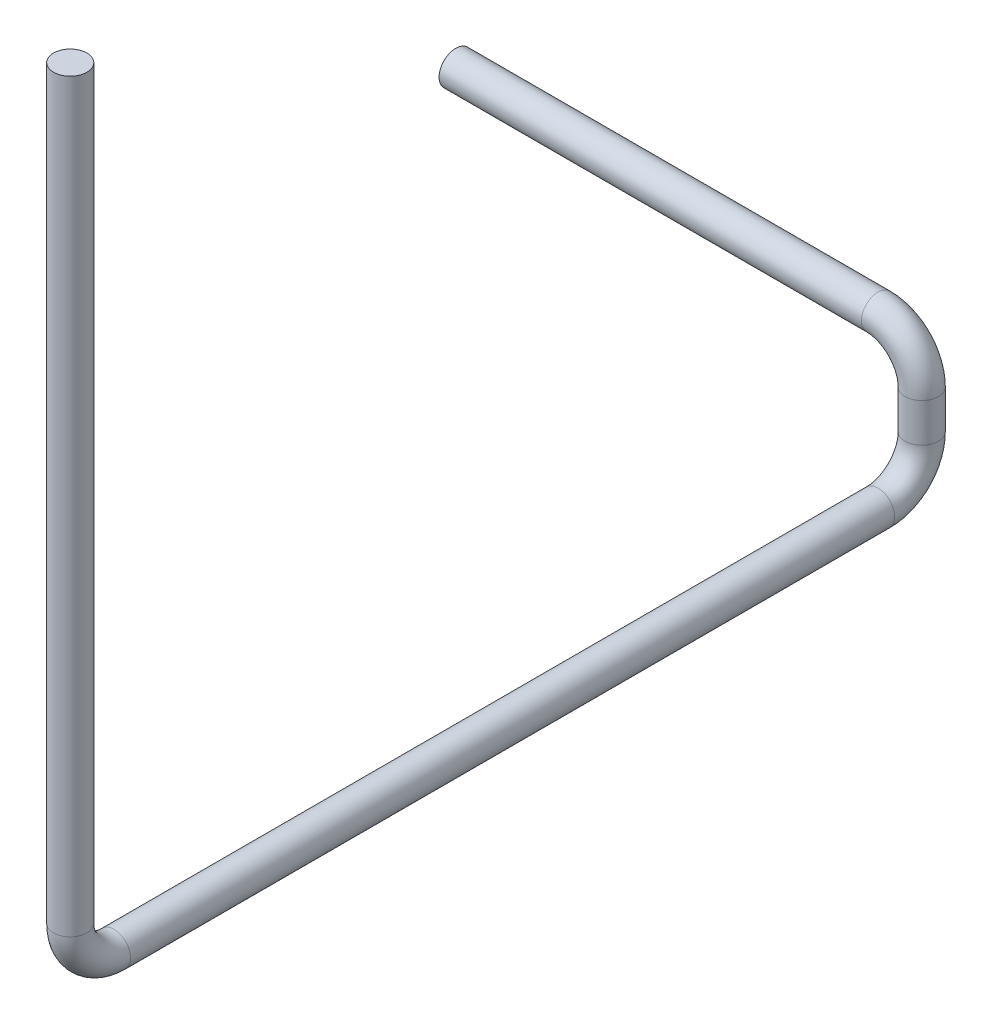
ISO-10303-21;
HEADER;
FILE_DESCRIPTION(('STEP AP214'),'2;1');
FILE_NAME('part.step','',(''),(''),'','','');
FILE_SCHEMA(('AUTOMOTIVE_DESIGN { 1 0 10303 214 1 1 1 1 }'));
ENDSEC;
DATA;
#1=APPLICATION_CONTEXT('core data for automotive mechanical design processes');
#2=APPLICATION_PROTOCOL_DEFINITION('international standard','automotive_design',2000,#1);
#3=PRODUCT_CONTEXT('',#1,'mechanical');
#4=PRODUCT('Part','Part','',(#3));
#5=PRODUCT_RELATED_PRODUCT_CATEGORY('part','',(#4));
#6=PRODUCT_DEFINITION_FORMATION('','',#4);
#7=PRODUCT_DEFINITION_CONTEXT('part definition',#1,'design');
#8=PRODUCT_DEFINITION('design','',#6,#7);
#9=PRODUCT_DEFINITION_SHAPE('','',#8);
#10=(LENGTH_UNIT() NAMED_UNIT(*) SI_UNIT(.MILLI.,.METRE.));
#11=(NAMED_UNIT(*) PLANE_ANGLE_UNIT() SI_UNIT($,.RADIAN.));
#12=(NAMED_UNIT(*) SI_UNIT($,.STERADIAN.) SOLID_ANGLE_UNIT());
#13=UNCERTAINTY_MEASURE_WITH_UNIT(LENGTH_MEASURE(1.E-05),#10,'distance_accuracy_value','');
#14=(GEOMETRIC_REPRESENTATION_CONTEXT(3) GLOBAL_UNCERTAINTY_ASSIGNED_CONTEXT((#13)) GLOBAL_UNIT_ASSIGNED_CONTEXT((#10,
#11,#12)) REPRESENTATION_CONTEXT('',''));
#15=CARTESIAN_POINT('',(0.,0.,0.));
#16=DIRECTION('',(0.,0.,1.));
#17=DIRECTION('',(1.,0.,0.));
#18=AXIS2_PLACEMENT_3D('',#15,#16,#17);
#19=CARTESIAN_POINT('',(1117.59003251347,-243.390046142145,2257.04999999998));
#20=DIRECTION('',(-1.,0.,0.));
#21=DIRECTION('',(0.,0.,1.));
#22=AXIS2_PLACEMENT_3D('',#19,#20,#21);
#23=PLANE('',#22);
#24=CARTESIAN_POINT('',(1117.59003251347,-243.390046142145,2257.04999999998));
#25=DIRECTION('',(-1.,0.,0.));
#26=DIRECTION('',(0.,0.,1.));
#27=AXIS2_PLACEMENT_3D('',#24,#25,#26);
#28=CIRCLE('',#27,19.05);
#29=CARTESIAN_POINT('',(1117.59003251347,-243.390046142145,2276.09999999998));
#30=VERTEX_POINT('',#29);
#31=EDGE_CURVE('E57',#30,#30,#28,.T.);
#32=ORIENTED_EDGE('',*,*,#31,.T.);
#33=EDGE_LOOP('',(#32));
#34=FACE_BOUND('',#33,.T.);
#35=ADVANCED_FACE('F45',(#34),#23,.T.);
#36=CARTESIAN_POINT('',(1650.47736651347,514.750220823855,3230.80586099998));
#37=DIRECTION('',(0.,-1.,0.));
#38=DIRECTION('',(0.,0.,-1.));
#39=AXIS2_PLACEMENT_3D('',#36,#37,#38);
#40=PLANE('',#39);
#41=CARTESIAN_POINT('',(1650.47736651347,514.750220823855,3230.80586099998));
#42=DIRECTION('',(0.,-1.,0.));
#43=DIRECTION('',(0.,0.,-1.));
#44=AXIS2_PLACEMENT_3D('',#41,#42,#43);
#45=CIRCLE('',#44,19.05);
#46=CARTESIAN_POINT('',(1650.47736651347,514.750220823855,3211.75586099998));
#47=VERTEX_POINT('',#46);
#48=EDGE_CURVE('E12',#47,#47,#45,.T.);
#49=ORIENTED_EDGE('',*,*,#48,.F.);
#50=EDGE_LOOP('',(#49));
#51=FACE_BOUND('',#50,.T.);
#52=ADVANCED_FACE('F63',(#51),#40,.F.);
#53=CARTESIAN_POINT('',(1117.59003251347,-243.390046142145,2257.04999999998));
#54=DIRECTION('',(1.,0.,0.));
#55=DIRECTION('',(0.,0.,-1.));
#56=AXIS2_PLACEMENT_3D('',#53,#54,#55);
#57=CYLINDRICAL_SURFACE('',#56,19.05);
#58=CARTESIAN_POINT('',(1600.47736651347,-243.390046142145,2257.04999999998));
#59=DIRECTION('',(-1.,0.,0.));
#60=DIRECTION('',(0.,0.,1.));
#61=AXIS2_PLACEMENT_3D('',#58,#59,#60);
#62=CIRCLE('',#61,19.05);
#63=CARTESIAN_POINT('',(1600.47736651347,-224.340046142145,2257.04999999998));
#64=VERTEX_POINT('',#63);
#65=EDGE_CURVE('E105',#64,#64,#62,.T.);
#66=ORIENTED_EDGE('',*,*,#65,.T.);
#67=EDGE_LOOP('',(#66));
#68=FACE_BOUND('',#67,.T.);
#69=ORIENTED_EDGE('',*,*,#31,.F.);
#70=EDGE_LOOP('',(#69));
#71=FACE_BOUND('',#70,.T.);
#72=ADVANCED_FACE('F65',(#68,#71),#57,.T.);
#73=CARTESIAN_POINT('',(1600.47736651347,-293.390046142145,2257.04999999998));
#74=DIRECTION('',(0.,0.,-1.));
#75=DIRECTION('',(-1.,0.,0.));
#76=AXIS2_PLACEMENT_3D('',#73,#74,#75);
#77=TOROIDAL_SURFACE('',#76,49.9999999999999,19.05);
#78=CARTESIAN_POINT('',(1650.47736651347,-293.390046142145,2257.04999999998));
#79=DIRECTION('',(0.,1.,0.));
#80=DIRECTION('',(0.,0.,1.));
#81=AXIS2_PLACEMENT_3D('',#78,#79,#80);
#82=CIRCLE('',#81,19.05);
#83=CARTESIAN_POINT('',(1669.52736651347,-293.390046142145,2257.04999999998));
#84=VERTEX_POINT('',#83);
#85=EDGE_CURVE('E102',#84,#84,#82,.T.);
#86=CARTESIAN_POINT('',(1600.47736651347,-293.390046142145,2257.04999999998));
#87=DIRECTION('',(0.,0.,-1.));
#88=DIRECTION('',(-1.,0.,0.));
#89=AXIS2_PLACEMENT_3D('',#86,#87,#88);
#90=CIRCLE('',#89,69.0499999999999);
#91=EDGE_CURVE('',#64,#84,#90,.T.);
#92=ORIENTED_EDGE('',*,*,#65,.F.);
#93=ORIENTED_EDGE('',*,*,#85,.T.);
#94=ORIENTED_EDGE('',*,*,#91,.T.);
#95=ORIENTED_EDGE('',*,*,#91,.F.);
#96=EDGE_LOOP('',(#92,#94,#93,#95));
#97=FACE_BOUND('',#96,.T.);
#98=ADVANCED_FACE('F70',(#97),#77,.T.);
#99=CARTESIAN_POINT('',(1650.47736651347,-293.390046142145,2257.04999999998));
#100=DIRECTION('',(0.,-1.,0.));
#101=DIRECTION('',(0.,0.,-1.));
#102=AXIS2_PLACEMENT_3D('',#99,#100,#101);
#103=CYLINDRICAL_SURFACE('',#102,19.05);
#104=CARTESIAN_POINT('',(1650.47736651347,-337.599174545866,2257.04999999998));
#105=DIRECTION('',(0.,1.,0.));
#106=DIRECTION('',(0.,0.,1.));
#107=AXIS2_PLACEMENT_3D('',#104,#105,#106);
#108=CIRCLE('',#107,19.05);
#109=CARTESIAN_POINT('',(1650.47736651347,-337.599174545866,2237.99999999998));
#110=VERTEX_POINT('',#109);
#111=EDGE_CURVE('E107',#110,#110,#108,.T.);
#112=ORIENTED_EDGE('',*,*,#111,.T.);
#113=EDGE_LOOP('',(#112));
#114=FACE_BOUND('',#113,.T.);
#115=ORIENTED_EDGE('',*,*,#85,.F.);
#116=EDGE_LOOP('',(#115));
#117=FACE_BOUND('',#116,.T.);
#118=ADVANCED_FACE('F90',(#114,#117),#103,.T.);
#119=CARTESIAN_POINT('',(1650.47736651347,-337.599174545866,2307.04999999998));
#120=DIRECTION('',(-1.,0.,0.));
#121=DIRECTION('',(0.,0.,1.));
#122=AXIS2_PLACEMENT_3D('',#119,#120,#121);
#123=TOROIDAL_SURFACE('',#122,49.9999999999994,19.05);
#124=CARTESIAN_POINT('',(1650.47736651347,-387.599174545866,2307.04999999998));
#125=DIRECTION('',(0.,0.,-1.));
#126=DIRECTION('',(0.,1.,0.));
#127=AXIS2_PLACEMENT_3D('',#124,#125,#126);
#128=CIRCLE('',#127,19.05);
#129=CARTESIAN_POINT('',(1650.47736651347,-406.649174545866,2307.04999999998));
#130=VERTEX_POINT('',#129);
#131=EDGE_CURVE('E113',#130,#130,#128,.T.);
#132=CARTESIAN_POINT('',(1650.47736651347,-337.599174545866,2307.04999999998));
#133=DIRECTION('',(-1.,0.,0.));
#134=DIRECTION('',(0.,0.,1.));
#135=AXIS2_PLACEMENT_3D('',#132,#133,#134);
#136=CIRCLE('',#135,69.0499999999994);
#137=EDGE_CURVE('',#110,#130,#136,.T.);
#138=ORIENTED_EDGE('',*,*,#111,.F.);
#139=ORIENTED_EDGE('',*,*,#131,.T.);
#140=ORIENTED_EDGE('',*,*,#137,.T.);
#141=ORIENTED_EDGE('',*,*,#137,.F.);
#142=EDGE_LOOP('',(#138,#140,#139,#141));
#143=FACE_BOUND('',#142,.T.);
#144=ADVANCED_FACE('F86',(#143),#123,.T.);
#145=CARTESIAN_POINT('',(1650.47736651347,-387.599174545866,2307.04999999998));
#146=DIRECTION('',(0.,0.,1.));
#147=DIRECTION('',(1.,0.,0.));
#148=AXIS2_PLACEMENT_3D('',#145,#146,#147);
#149=CYLINDRICAL_SURFACE('',#148,19.05);
#150=CARTESIAN_POINT('',(1650.47736651347,-387.599174545866,3180.80586099998));
#151=DIRECTION('',(0.,0.,-1.));
#152=DIRECTION('',(0.,1.,0.));
#153=AXIS2_PLACEMENT_3D('',#150,#151,#152);
#154=CIRCLE('',#153,19.05);
#155=CARTESIAN_POINT('',(1650.47736651347,-406.649174545866,3180.80586099998));
#156=VERTEX_POINT('',#155);
#157=EDGE_CURVE('E116',#156,#156,#154,.T.);
#158=ORIENTED_EDGE('',*,*,#157,.T.);
#159=EDGE_LOOP('',(#158));
#160=FACE_BOUND('',#159,.T.);
#161=ORIENTED_EDGE('',*,*,#131,.F.);
#162=EDGE_LOOP('',(#161));
#163=FACE_BOUND('',#162,.T.);
#164=ADVANCED_FACE('F80',(#160,#163),#149,.T.);
#165=CARTESIAN_POINT('',(1650.47736651347,-337.599174545866,3180.80586099998));
#166=DIRECTION('',(-1.,0.,0.));
#167=DIRECTION('',(0.,0.,1.));
#168=AXIS2_PLACEMENT_3D('',#165,#166,#167);
#169=TOROIDAL_SURFACE('',#168,50.,19.05);
#170=CARTESIAN_POINT('',(1650.47736651347,-337.599174545866,3230.80586099998));
#171=DIRECTION('',(0.,-1.,0.));
#172=DIRECTION('',(0.,0.,-1.));
#173=AXIS2_PLACEMENT_3D('',#170,#171,#172);
#174=CIRCLE('',#173,19.05);
#175=CARTESIAN_POINT('',(1650.47736651347,-337.599174545866,3249.85586099998));
#176=VERTEX_POINT('',#175);
#177=EDGE_CURVE('E52',#176,#176,#174,.T.);
#178=CARTESIAN_POINT('',(1650.47736651347,-337.599174545866,3180.80586099998));
#179=DIRECTION('',(-1.,0.,0.));
#180=DIRECTION('',(0.,0.,1.));
#181=AXIS2_PLACEMENT_3D('',#178,#179,#180);
#182=CIRCLE('',#181,69.0500000000001);
#183=EDGE_CURVE('',#156,#176,#182,.T.);
#184=ORIENTED_EDGE('',*,*,#157,.F.);
#185=ORIENTED_EDGE('',*,*,#177,.T.);
#186=ORIENTED_EDGE('',*,*,#183,.T.);
#187=ORIENTED_EDGE('',*,*,#183,.F.);
#188=EDGE_LOOP('',(#184,#186,#185,#187));
#189=FACE_BOUND('',#188,.T.);
#190=ADVANCED_FACE('F76',(#189),#169,.T.);
#191=CARTESIAN_POINT('',(1650.47736651347,-337.599174545866,3230.80586099998));
#192=DIRECTION('',(0.,1.,0.));
#193=DIRECTION('',(0.,0.,1.));
#194=AXIS2_PLACEMENT_3D('',#191,#192,#193);
#195=CYLINDRICAL_SURFACE('',#194,19.05);
#196=ORIENTED_EDGE('',*,*,#48,.T.);
#197=EDGE_LOOP('',(#196));
#198=FACE_BOUND('',#197,.T.);
#199=ORIENTED_EDGE('',*,*,#177,.F.);
#200=EDGE_LOOP('',(#199));
#201=FACE_BOUND('',#200,.T.);
#202=ADVANCED_FACE('F60',(#198,#201),#195,.T.);
#203=CLOSED_SHELL('',(#35,#52,#72,#98,#118,#144,#164,#190,#202));
#204=MANIFOLD_SOLID_BREP('B2',#203);
#205=ADVANCED_BREP_SHAPE_REPRESENTATION('',(#18,#204),#14);
#206=SHAPE_DEFINITION_REPRESENTATION(#9,#205);
ENDSEC;
END-ISO-10303-21;
